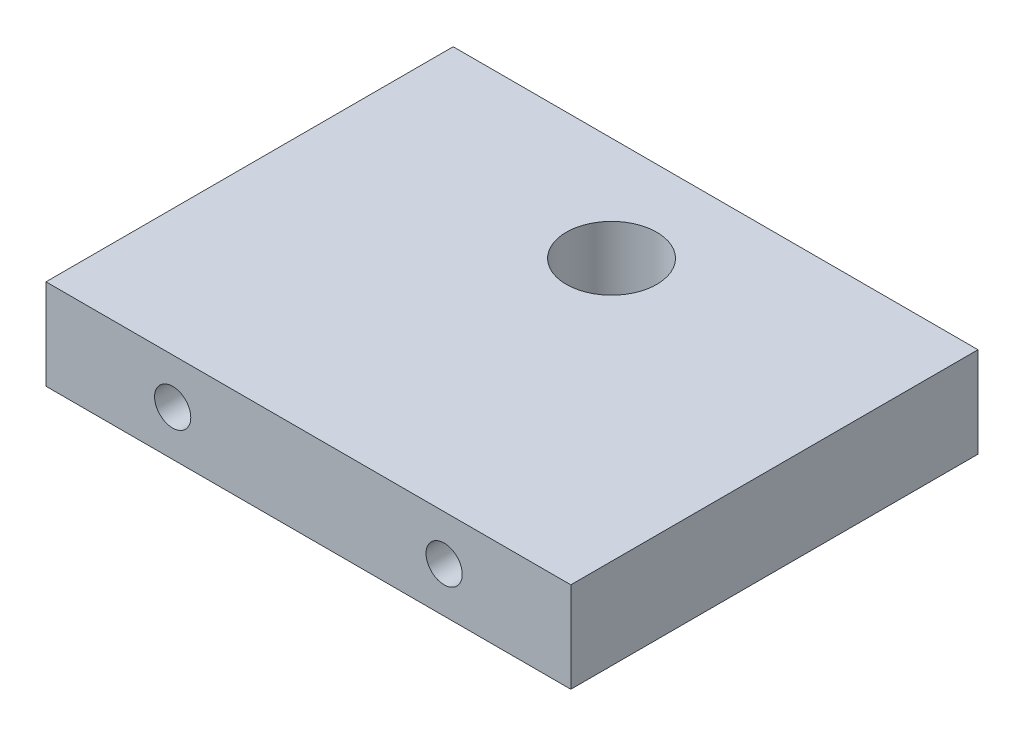
ISO-10303-21;
HEADER;
FILE_DESCRIPTION(('STEP AP214'),'2;1');
FILE_NAME('part.step','',(''),(''),'','','');
FILE_SCHEMA(('AUTOMOTIVE_DESIGN { 1 0 10303 214 1 1 1 1 }'));
ENDSEC;
DATA;
#1=APPLICATION_CONTEXT('core data for automotive mechanical design processes');
#2=APPLICATION_PROTOCOL_DEFINITION('international standard','automotive_design',2000,#1);
#3=PRODUCT_CONTEXT('',#1,'mechanical');
#4=PRODUCT('Part','Part','',(#3));
#5=PRODUCT_RELATED_PRODUCT_CATEGORY('part','',(#4));
#6=PRODUCT_DEFINITION_FORMATION('','',#4);
#7=PRODUCT_DEFINITION_CONTEXT('part definition',#1,'design');
#8=PRODUCT_DEFINITION('design','',#6,#7);
#9=PRODUCT_DEFINITION_SHAPE('','',#8);
#10=(LENGTH_UNIT() NAMED_UNIT(*) SI_UNIT(.MILLI.,.METRE.));
#11=(NAMED_UNIT(*) PLANE_ANGLE_UNIT() SI_UNIT($,.RADIAN.));
#12=(NAMED_UNIT(*) SI_UNIT($,.STERADIAN.) SOLID_ANGLE_UNIT());
#13=UNCERTAINTY_MEASURE_WITH_UNIT(LENGTH_MEASURE(1.E-05),#10,'distance_accuracy_value','');
#14=(GEOMETRIC_REPRESENTATION_CONTEXT(3) GLOBAL_UNCERTAINTY_ASSIGNED_CONTEXT((#13)) GLOBAL_UNIT_ASSIGNED_CONTEXT((#10,
#11,#12)) REPRESENTATION_CONTEXT('',''));
#15=CARTESIAN_POINT('',(0.,0.,0.));
#16=DIRECTION('',(0.,0.,1.));
#17=DIRECTION('',(1.,0.,0.));
#18=AXIS2_PLACEMENT_3D('',#15,#16,#17);
#19=CARTESIAN_POINT('',(0.,0.,55.));
#20=DIRECTION('',(1.,0.,0.));
#21=DIRECTION('',(0.,1.,0.));
#22=AXIS2_PLACEMENT_3D('',#19,#20,#21);
#23=PLANE('',#22);
#24=DIRECTION('',(0.,1.,0.));
#25=VECTOR('',#24,1.);
#26=CARTESIAN_POINT('',(0.,-10.,10.));
#27=LINE('',#26,#25);
#28=CARTESIAN_POINT('',(0.,-10.,10.));
#29=VERTEX_POINT('',#28);
#30=CARTESIAN_POINT('',(0.,0.,10.));
#31=VERTEX_POINT('',#30);
#32=EDGE_CURVE('E61',#29,#31,#27,.T.);
#33=ORIENTED_EDGE('',*,*,#32,.F.);
#34=DIRECTION('',(0.,0.,-1.));
#35=VECTOR('',#34,1.);
#36=CARTESIAN_POINT('',(0.,-10.,55.));
#37=LINE('',#36,#35);
#38=CARTESIAN_POINT('',(0.,-10.,55.));
#39=VERTEX_POINT('',#38);
#40=EDGE_CURVE('E13',#39,#29,#37,.T.);
#41=ORIENTED_EDGE('',*,*,#40,.F.);
#42=DIRECTION('',(0.,-1.,0.));
#43=VECTOR('',#42,1.);
#44=CARTESIAN_POINT('',(0.,0.,55.));
#45=LINE('',#44,#43);
#46=CARTESIAN_POINT('',(0.,0.,55.));
#47=VERTEX_POINT('',#46);
#48=EDGE_CURVE('E106',#47,#39,#45,.T.);
#49=ORIENTED_EDGE('',*,*,#48,.F.);
#50=DIRECTION('',(0.,0.,-1.));
#51=VECTOR('',#50,1.);
#52=CARTESIAN_POINT('',(0.,0.,55.));
#53=LINE('',#52,#51);
#54=EDGE_CURVE('E99',#47,#31,#53,.T.);
#55=ORIENTED_EDGE('',*,*,#54,.T.);
#56=EDGE_LOOP('',(#33,#41,#49,#55));
#57=FACE_BOUND('',#56,.T.);
#58=ADVANCED_FACE('F46',(#57),#23,.F.);
#59=CARTESIAN_POINT('',(0.,-10.,55.));
#60=DIRECTION('',(0.,1.,0.));
#61=DIRECTION('',(0.,0.,1.));
#62=AXIS2_PLACEMENT_3D('',#59,#60,#61);
#63=PLANE('',#62);
#64=CARTESIAN_POINT('',(29.,-10.,21.5));
#65=DIRECTION('',(0.,1.,0.));
#66=DIRECTION('',(0.,0.,1.));
#67=AXIS2_PLACEMENT_3D('',#64,#65,#66);
#68=CIRCLE('',#67,5.);
#69=CARTESIAN_POINT('',(29.,-10.,26.5));
#70=VERTEX_POINT('',#69);
#71=EDGE_CURVE('E93',#70,#70,#68,.T.);
#72=ORIENTED_EDGE('',*,*,#71,.T.);
#73=EDGE_LOOP('',(#72));
#74=FACE_BOUND('',#73,.T.);
#75=DIRECTION('',(-1.,0.,0.));
#76=VECTOR('',#75,1.);
#77=CARTESIAN_POINT('',(58.,-10.,10.));
#78=LINE('',#77,#76);
#79=CARTESIAN_POINT('',(58.,-10.,10.));
#80=VERTEX_POINT('',#79);
#81=EDGE_CURVE('E86',#80,#29,#78,.T.);
#82=ORIENTED_EDGE('',*,*,#81,.F.);
#83=DIRECTION('',(0.,0.,-1.));
#84=VECTOR('',#83,1.);
#85=CARTESIAN_POINT('',(58.,-10.,55.));
#86=LINE('',#85,#84);
#87=CARTESIAN_POINT('',(58.,-10.,55.));
#88=VERTEX_POINT('',#87);
#89=EDGE_CURVE('E54',#88,#80,#86,.T.);
#90=ORIENTED_EDGE('',*,*,#89,.F.);
#91=DIRECTION('',(1.,0.,0.));
#92=VECTOR('',#91,1.);
#93=CARTESIAN_POINT('',(0.,-10.,55.));
#94=LINE('',#93,#92);
#95=EDGE_CURVE('E103',#39,#88,#94,.T.);
#96=ORIENTED_EDGE('',*,*,#95,.F.);
#97=ORIENTED_EDGE('',*,*,#40,.T.);
#98=EDGE_LOOP('',(#82,#90,#96,#97));
#99=FACE_BOUND('',#98,.T.);
#100=ADVANCED_FACE('F102',(#74,#99),#63,.F.);
#101=CARTESIAN_POINT('',(58.,0.,55.));
#102=DIRECTION('',(-1.,0.,0.));
#103=DIRECTION('',(0.,-1.,0.));
#104=AXIS2_PLACEMENT_3D('',#101,#102,#103);
#105=PLANE('',#104);
#106=DIRECTION('',(0.,-1.,0.));
#107=VECTOR('',#106,1.);
#108=CARTESIAN_POINT('',(58.,0.,10.));
#109=LINE('',#108,#107);
#110=CARTESIAN_POINT('',(58.,0.,10.));
#111=VERTEX_POINT('',#110);
#112=EDGE_CURVE('E89',#111,#80,#109,.T.);
#113=ORIENTED_EDGE('',*,*,#112,.F.);
#114=DIRECTION('',(0.,0.,-1.));
#115=VECTOR('',#114,1.);
#116=CARTESIAN_POINT('',(58.,0.,55.));
#117=LINE('',#116,#115);
#118=CARTESIAN_POINT('',(58.,0.,55.));
#119=VERTEX_POINT('',#118);
#120=EDGE_CURVE('E120',#119,#111,#117,.T.);
#121=ORIENTED_EDGE('',*,*,#120,.F.);
#122=DIRECTION('',(0.,1.,0.));
#123=VECTOR('',#122,1.);
#124=CARTESIAN_POINT('',(58.,0.,55.));
#125=LINE('',#124,#123);
#126=EDGE_CURVE('E105',#88,#119,#125,.T.);
#127=ORIENTED_EDGE('',*,*,#126,.F.);
#128=ORIENTED_EDGE('',*,*,#89,.T.);
#129=EDGE_LOOP('',(#113,#121,#127,#128));
#130=FACE_BOUND('',#129,.T.);
#131=ADVANCED_FACE('F124',(#130),#105,.F.);
#132=CARTESIAN_POINT('',(0.,0.,55.));
#133=DIRECTION('',(0.,-1.,0.));
#134=DIRECTION('',(0.,0.,-1.));
#135=AXIS2_PLACEMENT_3D('',#132,#133,#134);
#136=PLANE('',#135);
#137=CARTESIAN_POINT('',(29.,0.,21.5));
#138=DIRECTION('',(0.,1.,0.));
#139=DIRECTION('',(0.,0.,1.));
#140=AXIS2_PLACEMENT_3D('',#137,#138,#139);
#141=CIRCLE('',#140,5.);
#142=CARTESIAN_POINT('',(29.,0.,26.5));
#143=VERTEX_POINT('',#142);
#144=EDGE_CURVE('E171',#143,#143,#141,.T.);
#145=ORIENTED_EDGE('',*,*,#144,.F.);
#146=EDGE_LOOP('',(#145));
#147=FACE_BOUND('',#146,.T.);
#148=DIRECTION('',(1.,0.,0.));
#149=VECTOR('',#148,1.);
#150=CARTESIAN_POINT('',(0.,0.,10.));
#151=LINE('',#150,#149);
#152=EDGE_CURVE('E100',#31,#111,#151,.T.);
#153=ORIENTED_EDGE('',*,*,#152,.F.);
#154=ORIENTED_EDGE('',*,*,#54,.F.);
#155=DIRECTION('',(-1.,0.,0.));
#156=VECTOR('',#155,1.);
#157=CARTESIAN_POINT('',(0.,0.,55.));
#158=LINE('',#157,#156);
#159=EDGE_CURVE('E69',#119,#47,#158,.T.);
#160=ORIENTED_EDGE('',*,*,#159,.F.);
#161=ORIENTED_EDGE('',*,*,#120,.T.);
#162=EDGE_LOOP('',(#153,#154,#160,#161));
#163=FACE_BOUND('',#162,.T.);
#164=ADVANCED_FACE('F127',(#147,#163),#136,.F.);
#165=CARTESIAN_POINT('',(14.,-5.,55.));
#166=DIRECTION('',(0.,0.,-1.));
#167=DIRECTION('',(-1.,0.,0.));
#168=AXIS2_PLACEMENT_3D('',#165,#166,#167);
#169=CYLINDRICAL_SURFACE('',#168,2.);
#170=CARTESIAN_POINT('',(14.,-5.,55.));
#171=DIRECTION('',(0.,0.,1.));
#172=DIRECTION('',(1.,0.,0.));
#173=AXIS2_PLACEMENT_3D('',#170,#171,#172);
#174=CIRCLE('',#173,2.);
#175=CARTESIAN_POINT('',(16.,-5.,55.));
#176=VERTEX_POINT('',#175);
#177=EDGE_CURVE('E110',#176,#176,#174,.T.);
#178=ORIENTED_EDGE('',*,*,#177,.T.);
#179=EDGE_LOOP('',(#178));
#180=FACE_BOUND('',#179,.T.);
#181=CARTESIAN_POINT('',(14.,-5.,10.));
#182=DIRECTION('',(0.,0.,-1.));
#183=DIRECTION('',(-1.,0.,0.));
#184=AXIS2_PLACEMENT_3D('',#181,#182,#183);
#185=CIRCLE('',#184,2.);
#186=CARTESIAN_POINT('',(12.,-5.,10.));
#187=VERTEX_POINT('',#186);
#188=EDGE_CURVE('E131',#187,#187,#185,.T.);
#189=ORIENTED_EDGE('',*,*,#188,.T.);
#190=EDGE_LOOP('',(#189));
#191=FACE_BOUND('',#190,.T.);
#192=ADVANCED_FACE('F148',(#180,#191),#169,.F.);
#193=CARTESIAN_POINT('',(44.,-5.,55.));
#194=DIRECTION('',(0.,0.,-1.));
#195=DIRECTION('',(-1.,0.,0.));
#196=AXIS2_PLACEMENT_3D('',#193,#194,#195);
#197=CYLINDRICAL_SURFACE('',#196,2.);
#198=CARTESIAN_POINT('',(44.,-5.,55.));
#199=DIRECTION('',(0.,0.,1.));
#200=DIRECTION('',(1.,0.,0.));
#201=AXIS2_PLACEMENT_3D('',#198,#199,#200);
#202=CIRCLE('',#201,2.);
#203=CARTESIAN_POINT('',(46.,-5.,55.));
#204=VERTEX_POINT('',#203);
#205=EDGE_CURVE('E113',#204,#204,#202,.T.);
#206=ORIENTED_EDGE('',*,*,#205,.T.);
#207=EDGE_LOOP('',(#206));
#208=FACE_BOUND('',#207,.T.);
#209=CARTESIAN_POINT('',(44.,-5.,10.));
#210=DIRECTION('',(0.,0.,-1.));
#211=DIRECTION('',(-1.,0.,0.));
#212=AXIS2_PLACEMENT_3D('',#209,#210,#211);
#213=CIRCLE('',#212,2.);
#214=CARTESIAN_POINT('',(42.,-5.,10.));
#215=VERTEX_POINT('',#214);
#216=EDGE_CURVE('E49',#215,#215,#213,.T.);
#217=ORIENTED_EDGE('',*,*,#216,.T.);
#218=EDGE_LOOP('',(#217));
#219=FACE_BOUND('',#218,.T.);
#220=ADVANCED_FACE('F136',(#208,#219),#197,.F.);
#221=CARTESIAN_POINT('',(0.,0.,55.));
#222=DIRECTION('',(0.,0.,1.));
#223=DIRECTION('',(1.,0.,0.));
#224=AXIS2_PLACEMENT_3D('',#221,#222,#223);
#225=PLANE('',#224);
#226=ORIENTED_EDGE('',*,*,#177,.F.);
#227=EDGE_LOOP('',(#226));
#228=FACE_BOUND('',#227,.T.);
#229=ORIENTED_EDGE('',*,*,#48,.T.);
#230=ORIENTED_EDGE('',*,*,#95,.T.);
#231=ORIENTED_EDGE('',*,*,#126,.T.);
#232=ORIENTED_EDGE('',*,*,#159,.T.);
#233=EDGE_LOOP('',(#229,#230,#231,#232));
#234=FACE_BOUND('',#233,.T.);
#235=ORIENTED_EDGE('',*,*,#205,.F.);
#236=EDGE_LOOP('',(#235));
#237=FACE_BOUND('',#236,.T.);
#238=ADVANCED_FACE('F108',(#228,#234,#237),#225,.T.);
#239=CARTESIAN_POINT('',(0.,0.,10.));
#240=DIRECTION('',(0.,0.,-1.));
#241=DIRECTION('',(-1.,0.,0.));
#242=AXIS2_PLACEMENT_3D('',#239,#240,#241);
#243=PLANE('',#242);
#244=ORIENTED_EDGE('',*,*,#188,.F.);
#245=EDGE_LOOP('',(#244));
#246=FACE_BOUND('',#245,.T.);
#247=ORIENTED_EDGE('',*,*,#216,.F.);
#248=EDGE_LOOP('',(#247));
#249=FACE_BOUND('',#248,.T.);
#250=ORIENTED_EDGE('',*,*,#81,.T.);
#251=ORIENTED_EDGE('',*,*,#32,.T.);
#252=ORIENTED_EDGE('',*,*,#152,.T.);
#253=ORIENTED_EDGE('',*,*,#112,.T.);
#254=EDGE_LOOP('',(#250,#251,#252,#253));
#255=FACE_BOUND('',#254,.T.);
#256=ADVANCED_FACE('F87',(#246,#249,#255),#243,.T.);
#257=CARTESIAN_POINT('',(29.,-10.,21.5));
#258=DIRECTION('',(0.,1.,0.));
#259=DIRECTION('',(0.,0.,1.));
#260=AXIS2_PLACEMENT_3D('',#257,#258,#259);
#261=CYLINDRICAL_SURFACE('',#260,5.);
#262=ORIENTED_EDGE('',*,*,#71,.F.);
#263=EDGE_LOOP('',(#262));
#264=FACE_BOUND('',#263,.T.);
#265=ORIENTED_EDGE('',*,*,#144,.T.);
#266=EDGE_LOOP('',(#265));
#267=FACE_BOUND('',#266,.T.);
#268=ADVANCED_FACE('F145',(#264,#267),#261,.F.);
#269=CLOSED_SHELL('',(#58,#100,#131,#164,#192,#220,#238,#256,#268));
#270=MANIFOLD_SOLID_BREP('B2',#269);
#271=ADVANCED_BREP_SHAPE_REPRESENTATION('',(#18,#270),#14);
#272=SHAPE_DEFINITION_REPRESENTATION(#9,#271);
ENDSEC;
END-ISO-10303-21;
